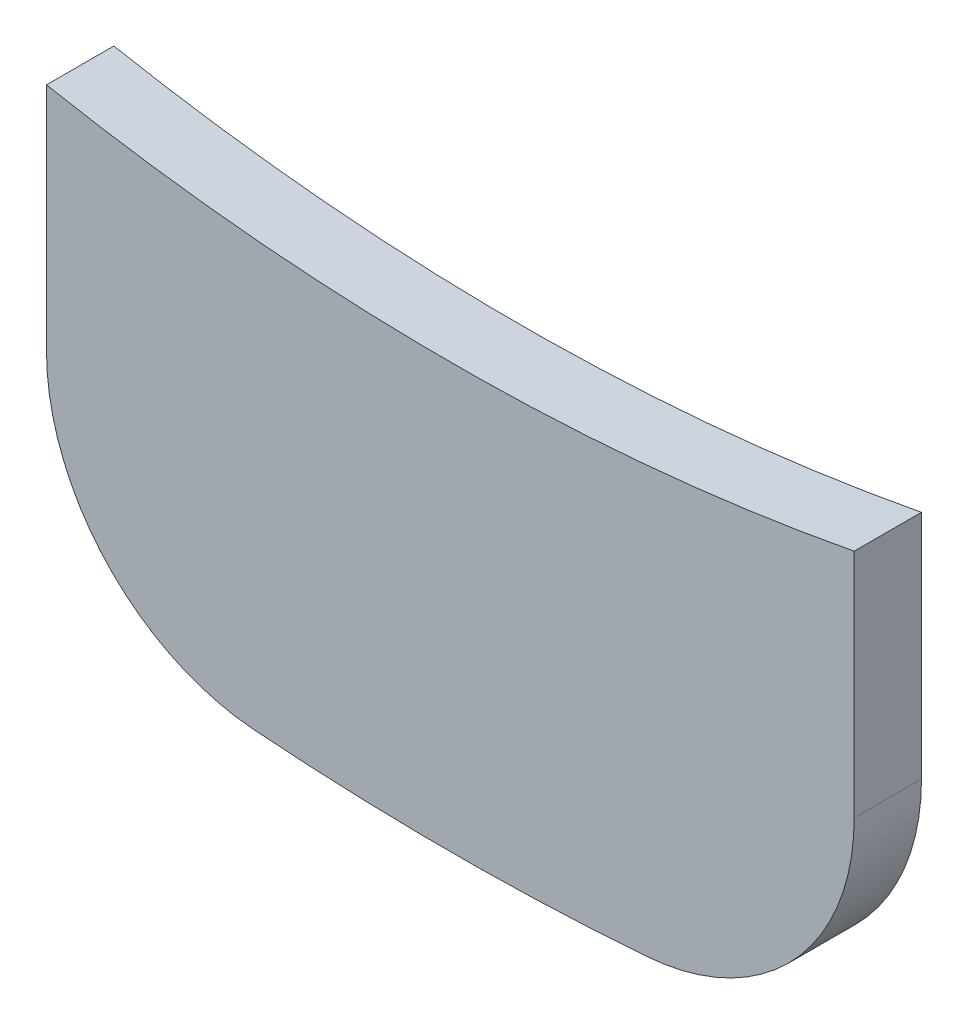
ISO-10303-21;
HEADER;
FILE_DESCRIPTION(('STEP AP214'),'2;1');
FILE_NAME('part.step','',(''),(''),'','','');
FILE_SCHEMA(('AUTOMOTIVE_DESIGN { 1 0 10303 214 1 1 1 1 }'));
ENDSEC;
DATA;
#1=APPLICATION_CONTEXT('core data for automotive mechanical design processes');
#2=APPLICATION_PROTOCOL_DEFINITION('international standard','automotive_design',2000,#1);
#3=PRODUCT_CONTEXT('',#1,'mechanical');
#4=PRODUCT('Part','Part','',(#3));
#5=PRODUCT_RELATED_PRODUCT_CATEGORY('part','',(#4));
#6=PRODUCT_DEFINITION_FORMATION('','',#4);
#7=PRODUCT_DEFINITION_CONTEXT('part definition',#1,'design');
#8=PRODUCT_DEFINITION('design','',#6,#7);
#9=PRODUCT_DEFINITION_SHAPE('','',#8);
#10=(LENGTH_UNIT() NAMED_UNIT(*) SI_UNIT(.MILLI.,.METRE.));
#11=(NAMED_UNIT(*) PLANE_ANGLE_UNIT() SI_UNIT($,.RADIAN.));
#12=(NAMED_UNIT(*) SI_UNIT($,.STERADIAN.) SOLID_ANGLE_UNIT());
#13=UNCERTAINTY_MEASURE_WITH_UNIT(LENGTH_MEASURE(1.E-05),#10,'distance_accuracy_value','');
#14=(GEOMETRIC_REPRESENTATION_CONTEXT(3) GLOBAL_UNCERTAINTY_ASSIGNED_CONTEXT((#13)) GLOBAL_UNIT_ASSIGNED_CONTEXT((#10,
#11,#12)) REPRESENTATION_CONTEXT('',''));
#15=CARTESIAN_POINT('',(0.,0.,0.));
#16=DIRECTION('',(0.,0.,1.));
#17=DIRECTION('',(1.,0.,0.));
#18=AXIS2_PLACEMENT_3D('',#15,#16,#17);
#19=CARTESIAN_POINT('',(18.0000000000046,-104.694794521981,3.));
#20=DIRECTION('',(-1.,0.,0.));
#21=DIRECTION('',(0.,-1.,0.));
#22=AXIS2_PLACEMENT_3D('',#19,#20,#21);
#23=PLANE('',#22);
#24=DIRECTION('',(0.,1.,0.));
#25=VECTOR('',#24,1.);
#26=CARTESIAN_POINT('',(18.0000000000046,-104.694794521981,0.));
#27=LINE('',#26,#25);
#28=CARTESIAN_POINT('',(18.0000000000046,-104.694794521981,0.));
#29=VERTEX_POINT('',#28);
#30=CARTESIAN_POINT('',(18.0000000000046,-94.3992055051304,0.));
#31=VERTEX_POINT('',#30);
#32=EDGE_CURVE('E121',#29,#31,#27,.T.);
#33=ORIENTED_EDGE('',*,*,#32,.T.);
#34=DIRECTION('',(0.,0.,-1.));
#35=VECTOR('',#34,1.);
#36=CARTESIAN_POINT('',(18.0000000000046,-94.3992055051304,3.));
#37=LINE('',#36,#35);
#38=CARTESIAN_POINT('',(18.0000000000046,-94.3992055051304,3.));
#39=VERTEX_POINT('',#38);
#40=EDGE_CURVE('E41',#39,#31,#37,.T.);
#41=ORIENTED_EDGE('',*,*,#40,.F.);
#42=DIRECTION('',(0.,1.,0.));
#43=VECTOR('',#42,1.);
#44=CARTESIAN_POINT('',(18.0000000000046,-104.694794521981,3.));
#45=LINE('',#44,#43);
#46=CARTESIAN_POINT('',(18.0000000000046,-104.694794521981,3.));
#47=VERTEX_POINT('',#46);
#48=EDGE_CURVE('E87',#47,#39,#45,.T.);
#49=ORIENTED_EDGE('',*,*,#48,.F.);
#50=DIRECTION('',(0.,0.,-1.));
#51=VECTOR('',#50,1.);
#52=CARTESIAN_POINT('',(18.0000000000046,-104.694794521981,3.));
#53=LINE('',#52,#51);
#54=EDGE_CURVE('E11',#47,#29,#53,.T.);
#55=ORIENTED_EDGE('',*,*,#54,.T.);
#56=EDGE_LOOP('',(#33,#41,#49,#55));
#57=FACE_BOUND('',#56,.T.);
#58=ADVANCED_FACE('F33',(#57),#23,.F.);
#59=CARTESIAN_POINT('',(0.,0.,3.));
#60=DIRECTION('',(0.,0.,-1.));
#61=DIRECTION('',(-1.,0.,0.));
#62=AXIS2_PLACEMENT_3D('',#59,#60,#61);
#63=CYLINDRICAL_SURFACE('',#62,96.1);
#64=CARTESIAN_POINT('',(0.,0.,0.));
#65=DIRECTION('',(0.,0.,-1.));
#66=DIRECTION('',(1.,0.,0.));
#67=AXIS2_PLACEMENT_3D('',#64,#65,#66);
#68=CIRCLE('',#67,96.1);
#69=CARTESIAN_POINT('',(-18.0000000000068,-94.3992055051299,0.));
#70=VERTEX_POINT('',#69);
#71=EDGE_CURVE('E123',#31,#70,#68,.T.);
#72=ORIENTED_EDGE('',*,*,#71,.T.);
#73=DIRECTION('',(0.,0.,-1.));
#74=VECTOR('',#73,1.);
#75=CARTESIAN_POINT('',(-18.0000000000068,-94.3992055051299,3.));
#76=LINE('',#75,#74);
#77=CARTESIAN_POINT('',(-18.0000000000068,-94.3992055051299,3.));
#78=VERTEX_POINT('',#77);
#79=EDGE_CURVE('E110',#78,#70,#76,.T.);
#80=ORIENTED_EDGE('',*,*,#79,.F.);
#81=CARTESIAN_POINT('',(0.,0.,3.));
#82=DIRECTION('',(0.,0.,-1.));
#83=DIRECTION('',(1.,0.,0.));
#84=AXIS2_PLACEMENT_3D('',#81,#82,#83);
#85=CIRCLE('',#84,96.1);
#86=EDGE_CURVE('E101',#39,#78,#85,.T.);
#87=ORIENTED_EDGE('',*,*,#86,.F.);
#88=ORIENTED_EDGE('',*,*,#40,.T.);
#89=EDGE_LOOP('',(#72,#80,#87,#88));
#90=FACE_BOUND('',#89,.T.);
#91=ADVANCED_FACE('F135',(#90),#63,.F.);
#92=CARTESIAN_POINT('',(-18.0000000000068,-94.39920550513,3.));
#93=DIRECTION('',(1.,0.,0.));
#94=DIRECTION('',(0.,1.,0.));
#95=AXIS2_PLACEMENT_3D('',#92,#93,#94);
#96=PLANE('',#95);
#97=DIRECTION('',(0.,-1.,0.));
#98=VECTOR('',#97,1.);
#99=CARTESIAN_POINT('',(-18.0000000000068,-94.39920550513,0.));
#100=LINE('',#99,#98);
#101=CARTESIAN_POINT('',(-18.0000000000068,-104.694794521981,0.));
#102=VERTEX_POINT('',#101);
#103=EDGE_CURVE('E109',#70,#102,#100,.T.);
#104=ORIENTED_EDGE('',*,*,#103,.T.);
#105=DIRECTION('',(0.,0.,-1.));
#106=VECTOR('',#105,1.);
#107=CARTESIAN_POINT('',(-18.0000000000068,-104.694794521981,3.));
#108=LINE('',#107,#106);
#109=CARTESIAN_POINT('',(-18.0000000000068,-104.694794521981,3.));
#110=VERTEX_POINT('',#109);
#111=EDGE_CURVE('E106',#110,#102,#108,.T.);
#112=ORIENTED_EDGE('',*,*,#111,.F.);
#113=DIRECTION('',(0.,-1.,0.));
#114=VECTOR('',#113,1.);
#115=CARTESIAN_POINT('',(-18.0000000000068,-94.39920550513,3.));
#116=LINE('',#115,#114);
#117=EDGE_CURVE('E95',#78,#110,#116,.T.);
#118=ORIENTED_EDGE('',*,*,#117,.F.);
#119=ORIENTED_EDGE('',*,*,#79,.T.);
#120=EDGE_LOOP('',(#104,#112,#118,#119));
#121=FACE_BOUND('',#120,.T.);
#122=ADVANCED_FACE('F107',(#121),#96,.F.);
#123=CARTESIAN_POINT('',(-8.00000000000625,-104.694794521981,3.));
#124=DIRECTION('',(0.,0.,-1.));
#125=DIRECTION('',(-1.,0.,0.));
#126=AXIS2_PLACEMENT_3D('',#123,#124,#125);
#127=CYLINDRICAL_SURFACE('',#126,10.0000000000005);
#128=CARTESIAN_POINT('',(-8.00000000000625,-104.694794521981,0.));
#129=DIRECTION('',(0.,0.,1.));
#130=DIRECTION('',(1.,0.,0.));
#131=AXIS2_PLACEMENT_3D('',#128,#129,#130);
#132=CIRCLE('',#131,10.0000000000005);
#133=CARTESIAN_POINT('',(-8.76190476191164,-114.665727333599,0.));
#134=VERTEX_POINT('',#133);
#135=EDGE_CURVE('E73',#102,#134,#132,.T.);
#136=ORIENTED_EDGE('',*,*,#135,.T.);
#137=DIRECTION('',(0.,0.,-1.));
#138=VECTOR('',#137,1.);
#139=CARTESIAN_POINT('',(-8.76190476191164,-114.665727333599,3.));
#140=LINE('',#139,#138);
#141=CARTESIAN_POINT('',(-8.76190476191164,-114.665727333599,3.));
#142=VERTEX_POINT('',#141);
#143=EDGE_CURVE('E111',#142,#134,#140,.T.);
#144=ORIENTED_EDGE('',*,*,#143,.F.);
#145=CARTESIAN_POINT('',(-8.00000000000625,-104.694794521981,3.));
#146=DIRECTION('',(0.,0.,1.));
#147=DIRECTION('',(1.,0.,0.));
#148=AXIS2_PLACEMENT_3D('',#145,#146,#147);
#149=CIRCLE('',#148,10.0000000000005);
#150=EDGE_CURVE('E99',#110,#142,#149,.T.);
#151=ORIENTED_EDGE('',*,*,#150,.F.);
#152=ORIENTED_EDGE('',*,*,#111,.T.);
#153=EDGE_LOOP('',(#136,#144,#151,#152));
#154=FACE_BOUND('',#153,.T.);
#155=ADVANCED_FACE('F113',(#154),#127,.T.);
#156=CARTESIAN_POINT('',(0.,0.,3.));
#157=DIRECTION('',(0.,0.,-1.));
#158=DIRECTION('',(-1.,0.,0.));
#159=AXIS2_PLACEMENT_3D('',#156,#157,#158);
#160=CYLINDRICAL_SURFACE('',#159,115.);
#161=CARTESIAN_POINT('',(0.,0.,0.));
#162=DIRECTION('',(0.,0.,1.));
#163=DIRECTION('',(1.,0.,0.));
#164=AXIS2_PLACEMENT_3D('',#161,#162,#163);
#165=CIRCLE('',#164,115.);
#166=CARTESIAN_POINT('',(8.76190476190872,-114.665727333599,0.));
#167=VERTEX_POINT('',#166);
#168=EDGE_CURVE('E80',#134,#167,#165,.T.);
#169=ORIENTED_EDGE('',*,*,#168,.T.);
#170=DIRECTION('',(0.,0.,-1.));
#171=VECTOR('',#170,1.);
#172=CARTESIAN_POINT('',(8.76190476190872,-114.665727333599,3.));
#173=LINE('',#172,#171);
#174=CARTESIAN_POINT('',(8.76190476190872,-114.665727333599,3.));
#175=VERTEX_POINT('',#174);
#176=EDGE_CURVE('E117',#175,#167,#173,.T.);
#177=ORIENTED_EDGE('',*,*,#176,.F.);
#178=CARTESIAN_POINT('',(0.,0.,3.));
#179=DIRECTION('',(0.,0.,1.));
#180=DIRECTION('',(1.,0.,0.));
#181=AXIS2_PLACEMENT_3D('',#178,#179,#180);
#182=CIRCLE('',#181,115.);
#183=EDGE_CURVE('E115',#142,#175,#182,.T.);
#184=ORIENTED_EDGE('',*,*,#183,.F.);
#185=ORIENTED_EDGE('',*,*,#143,.T.);
#186=EDGE_LOOP('',(#169,#177,#184,#185));
#187=FACE_BOUND('',#186,.T.);
#188=ADVANCED_FACE('F141',(#187),#160,.T.);
#189=CARTESIAN_POINT('',(8.00000000000464,-104.694794521981,3.));
#190=DIRECTION('',(0.,0.,-1.));
#191=DIRECTION('',(-1.,0.,0.));
#192=AXIS2_PLACEMENT_3D('',#189,#190,#191);
#193=CYLINDRICAL_SURFACE('',#192,10.0000000000001);
#194=CARTESIAN_POINT('',(8.00000000000464,-104.694794521981,0.));
#195=DIRECTION('',(0.,0.,1.));
#196=DIRECTION('',(1.,0.,0.));
#197=AXIS2_PLACEMENT_3D('',#194,#195,#196);
#198=CIRCLE('',#197,10.0000000000001);
#199=EDGE_CURVE('E128',#167,#29,#198,.T.);
#200=ORIENTED_EDGE('',*,*,#199,.T.);
#201=ORIENTED_EDGE('',*,*,#54,.F.);
#202=CARTESIAN_POINT('',(8.00000000000464,-104.694794521981,3.));
#203=DIRECTION('',(0.,0.,1.));
#204=DIRECTION('',(1.,0.,0.));
#205=AXIS2_PLACEMENT_3D('',#202,#203,#204);
#206=CIRCLE('',#205,9.99999999999999);
#207=EDGE_CURVE('E49',#175,#47,#206,.T.);
#208=ORIENTED_EDGE('',*,*,#207,.F.);
#209=ORIENTED_EDGE('',*,*,#176,.T.);
#210=EDGE_LOOP('',(#200,#201,#208,#209));
#211=FACE_BOUND('',#210,.T.);
#212=ADVANCED_FACE('F140',(#211),#193,.T.);
#213=CARTESIAN_POINT('',(8.00000000000464,-104.694794521981,3.));
#214=DIRECTION('',(0.,0.,1.));
#215=DIRECTION('',(1.,0.,0.));
#216=AXIS2_PLACEMENT_3D('',#213,#214,#215);
#217=PLANE('',#216);
#218=ORIENTED_EDGE('',*,*,#207,.T.);
#219=ORIENTED_EDGE('',*,*,#48,.T.);
#220=ORIENTED_EDGE('',*,*,#86,.T.);
#221=ORIENTED_EDGE('',*,*,#117,.T.);
#222=ORIENTED_EDGE('',*,*,#150,.T.);
#223=ORIENTED_EDGE('',*,*,#183,.T.);
#224=EDGE_LOOP('',(#218,#219,#220,#221,#222,#223));
#225=FACE_BOUND('',#224,.T.);
#226=ADVANCED_FACE('F97',(#225),#217,.T.);
#227=CARTESIAN_POINT('',(8.00000000000464,-104.694794521981,0.));
#228=DIRECTION('',(0.,0.,1.));
#229=DIRECTION('',(1.,0.,0.));
#230=AXIS2_PLACEMENT_3D('',#227,#228,#229);
#231=PLANE('',#230);
#232=ORIENTED_EDGE('',*,*,#32,.F.);
#233=ORIENTED_EDGE('',*,*,#199,.F.);
#234=ORIENTED_EDGE('',*,*,#168,.F.);
#235=ORIENTED_EDGE('',*,*,#135,.F.);
#236=ORIENTED_EDGE('',*,*,#103,.F.);
#237=ORIENTED_EDGE('',*,*,#71,.F.);
#238=EDGE_LOOP('',(#232,#233,#234,#235,#236,#237));
#239=FACE_BOUND('',#238,.T.);
#240=ADVANCED_FACE('F138',(#239),#231,.F.);
#241=CLOSED_SHELL('',(#58,#91,#122,#155,#188,#212,#226,#240));
#242=MANIFOLD_SOLID_BREP('B2',#241);
#243=ADVANCED_BREP_SHAPE_REPRESENTATION('',(#18,#242),#14);
#244=SHAPE_DEFINITION_REPRESENTATION(#9,#243);
ENDSEC;
END-ISO-10303-21;
